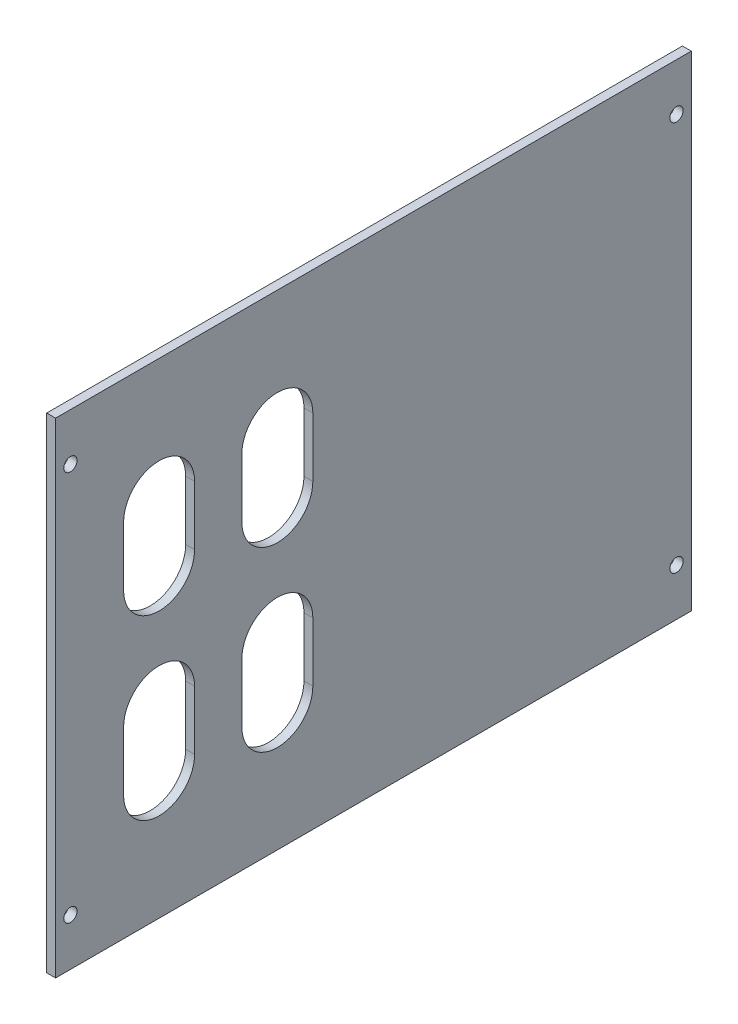
ISO-10303-21;
HEADER;
FILE_DESCRIPTION(('STEP AP214'),'2;1');
FILE_NAME('part.step','',(''),(''),'','','');
FILE_SCHEMA(('AUTOMOTIVE_DESIGN { 1 0 10303 214 1 1 1 1 }'));
ENDSEC;
DATA;
#1=APPLICATION_CONTEXT('core data for automotive mechanical design processes');
#2=APPLICATION_PROTOCOL_DEFINITION('international standard','automotive_design',2000,#1);
#3=PRODUCT_CONTEXT('',#1,'mechanical');
#4=PRODUCT('Part','Part','',(#3));
#5=PRODUCT_RELATED_PRODUCT_CATEGORY('part','',(#4));
#6=PRODUCT_DEFINITION_FORMATION('','',#4);
#7=PRODUCT_DEFINITION_CONTEXT('part definition',#1,'design');
#8=PRODUCT_DEFINITION('design','',#6,#7);
#9=PRODUCT_DEFINITION_SHAPE('','',#8);
#10=(LENGTH_UNIT() NAMED_UNIT(*) SI_UNIT(.MILLI.,.METRE.));
#11=(NAMED_UNIT(*) PLANE_ANGLE_UNIT() SI_UNIT($,.RADIAN.));
#12=(NAMED_UNIT(*) SI_UNIT($,.STERADIAN.) SOLID_ANGLE_UNIT());
#13=UNCERTAINTY_MEASURE_WITH_UNIT(LENGTH_MEASURE(1.E-05),#10,'distance_accuracy_value','');
#14=(GEOMETRIC_REPRESENTATION_CONTEXT(3) GLOBAL_UNCERTAINTY_ASSIGNED_CONTEXT((#13)) GLOBAL_UNIT_ASSIGNED_CONTEXT((#10,
#11,#12)) REPRESENTATION_CONTEXT('',''));
#15=CARTESIAN_POINT('',(0.,0.,0.));
#16=DIRECTION('',(0.,0.,1.));
#17=DIRECTION('',(1.,0.,0.));
#18=AXIS2_PLACEMENT_3D('',#15,#16,#17);
#19=CARTESIAN_POINT('',(-120.,0.,0.));
#20=DIRECTION('',(1.,0.,0.));
#21=DIRECTION('',(0.,-1.,0.));
#22=AXIS2_PLACEMENT_3D('',#19,#20,#21);
#23=PLANE('',#22);
#24=CARTESIAN_POINT('',(-120.,-66.,108.));
#25=DIRECTION('',(1.,0.,0.));
#26=DIRECTION('',(0.,1.,0.));
#27=AXIS2_PLACEMENT_3D('',#24,#25,#26);
#28=CIRCLE('',#27,2.25);
#29=CARTESIAN_POINT('',(-120.,-63.75,108.));
#30=VERTEX_POINT('',#29);
#31=EDGE_CURVE('E145',#30,#30,#28,.T.);
#32=ORIENTED_EDGE('',*,*,#31,.T.);
#33=EDGE_LOOP('',(#32));
#34=FACE_BOUND('',#33,.T.);
#35=CARTESIAN_POINT('',(-120.,66.,108.));
#36=DIRECTION('',(1.,0.,0.));
#37=DIRECTION('',(0.,1.,0.));
#38=AXIS2_PLACEMENT_3D('',#35,#36,#37);
#39=CIRCLE('',#38,2.25);
#40=CARTESIAN_POINT('',(-120.,68.25,108.));
#41=VERTEX_POINT('',#40);
#42=EDGE_CURVE('E227',#41,#41,#39,.T.);
#43=ORIENTED_EDGE('',*,*,#42,.T.);
#44=EDGE_LOOP('',(#43));
#45=FACE_BOUND('',#44,.T.);
#46=DIRECTION('',(0.,1.,0.));
#47=VECTOR('',#46,1.);
#48=CARTESIAN_POINT('',(-120.,40.,66.));
#49=LINE('',#48,#47);
#50=CARTESIAN_POINT('',(-120.,20.,66.));
#51=VERTEX_POINT('',#50);
#52=CARTESIAN_POINT('',(-120.,40.,66.));
#53=VERTEX_POINT('',#52);
#54=EDGE_CURVE('E264',#51,#53,#49,.T.);
#55=ORIENTED_EDGE('',*,*,#54,.T.);
#56=CARTESIAN_POINT('',(-120.,40.,78.));
#57=DIRECTION('',(1.,0.,0.));
#58=DIRECTION('',(0.,1.,0.));
#59=AXIS2_PLACEMENT_3D('',#56,#57,#58);
#60=CIRCLE('',#59,12.);
#61=CARTESIAN_POINT('',(-120.,40.,90.));
#62=VERTEX_POINT('',#61);
#63=EDGE_CURVE('E256',#53,#62,#60,.T.);
#64=ORIENTED_EDGE('',*,*,#63,.T.);
#65=DIRECTION('',(0.,-1.,0.));
#66=VECTOR('',#65,1.);
#67=CARTESIAN_POINT('',(-120.,40.,90.));
#68=LINE('',#67,#66);
#69=CARTESIAN_POINT('',(-120.,19.9999999999999,90.));
#70=VERTEX_POINT('',#69);
#71=EDGE_CURVE('E259',#62,#70,#68,.T.);
#72=ORIENTED_EDGE('',*,*,#71,.T.);
#73=CARTESIAN_POINT('',(-120.,20.,78.));
#74=DIRECTION('',(1.,0.,0.));
#75=DIRECTION('',(0.,1.,0.));
#76=AXIS2_PLACEMENT_3D('',#73,#74,#75);
#77=CIRCLE('',#76,12.);
#78=EDGE_CURVE('E39',#70,#51,#77,.T.);
#79=ORIENTED_EDGE('',*,*,#78,.T.);
#80=EDGE_LOOP('',(#55,#64,#72,#79));
#81=FACE_BOUND('',#80,.T.);
#82=DIRECTION('',(0.,-1.,0.));
#83=VECTOR('',#82,1.);
#84=CARTESIAN_POINT('',(-120.,-39.9999999999999,90.));
#85=LINE('',#84,#83);
#86=CARTESIAN_POINT('',(-120.,-19.9999999999999,90.));
#87=VERTEX_POINT('',#86);
#88=CARTESIAN_POINT('',(-120.,-39.9999999999999,90.));
#89=VERTEX_POINT('',#88);
#90=EDGE_CURVE('E278',#87,#89,#85,.T.);
#91=ORIENTED_EDGE('',*,*,#90,.T.);
#92=CARTESIAN_POINT('',(-120.,-39.9999999999999,78.));
#93=DIRECTION('',(1.,0.,0.));
#94=DIRECTION('',(0.,-1.,0.));
#95=AXIS2_PLACEMENT_3D('',#92,#93,#94);
#96=CIRCLE('',#95,12.);
#97=CARTESIAN_POINT('',(-120.,-39.9999999999999,66.));
#98=VERTEX_POINT('',#97);
#99=EDGE_CURVE('E260',#89,#98,#96,.T.);
#100=ORIENTED_EDGE('',*,*,#99,.T.);
#101=DIRECTION('',(0.,1.,0.));
#102=VECTOR('',#101,1.);
#103=CARTESIAN_POINT('',(-120.,-39.9999999999999,66.));
#104=LINE('',#103,#102);
#105=CARTESIAN_POINT('',(-120.,-19.9999999999999,66.));
#106=VERTEX_POINT('',#105);
#107=EDGE_CURVE('E292',#98,#106,#104,.T.);
#108=ORIENTED_EDGE('',*,*,#107,.T.);
#109=CARTESIAN_POINT('',(-120.,-19.9999999999999,78.));
#110=DIRECTION('',(1.,0.,0.));
#111=DIRECTION('',(0.,-1.,0.));
#112=AXIS2_PLACEMENT_3D('',#109,#110,#111);
#113=CIRCLE('',#112,12.);
#114=EDGE_CURVE('E289',#106,#87,#113,.T.);
#115=ORIENTED_EDGE('',*,*,#114,.T.);
#116=EDGE_LOOP('',(#91,#100,#108,#115));
#117=FACE_BOUND('',#116,.T.);
#118=DIRECTION('',(0.,-1.,0.));
#119=VECTOR('',#118,1.);
#120=CARTESIAN_POINT('',(-120.,-39.9999999999999,50.));
#121=LINE('',#120,#119);
#122=CARTESIAN_POINT('',(-120.,-19.9999999999999,50.));
#123=VERTEX_POINT('',#122);
#124=CARTESIAN_POINT('',(-120.,-39.9999999999999,50.));
#125=VERTEX_POINT('',#124);
#126=EDGE_CURVE('E113',#123,#125,#121,.T.);
#127=ORIENTED_EDGE('',*,*,#126,.T.);
#128=CARTESIAN_POINT('',(-120.,-39.9999999999999,38.));
#129=DIRECTION('',(1.,0.,0.));
#130=DIRECTION('',(0.,1.,0.));
#131=AXIS2_PLACEMENT_3D('',#128,#129,#130);
#132=CIRCLE('',#131,12.);
#133=CARTESIAN_POINT('',(-120.,-39.9999999999999,26.));
#134=VERTEX_POINT('',#133);
#135=EDGE_CURVE('E127',#125,#134,#132,.T.);
#136=ORIENTED_EDGE('',*,*,#135,.T.);
#137=DIRECTION('',(0.,1.,0.));
#138=VECTOR('',#137,1.);
#139=CARTESIAN_POINT('',(-120.,-39.9999999999999,26.));
#140=LINE('',#139,#138);
#141=CARTESIAN_POINT('',(-120.,-19.9999999999999,26.));
#142=VERTEX_POINT('',#141);
#143=EDGE_CURVE('E112',#134,#142,#140,.T.);
#144=ORIENTED_EDGE('',*,*,#143,.T.);
#145=CARTESIAN_POINT('',(-120.,-19.9999999999999,38.));
#146=DIRECTION('',(1.,0.,0.));
#147=DIRECTION('',(0.,1.,0.));
#148=AXIS2_PLACEMENT_3D('',#145,#146,#147);
#149=CIRCLE('',#148,12.);
#150=EDGE_CURVE('E98',#142,#123,#149,.T.);
#151=ORIENTED_EDGE('',*,*,#150,.T.);
#152=EDGE_LOOP('',(#127,#136,#144,#151));
#153=FACE_BOUND('',#152,.T.);
#154=DIRECTION('',(0.,1.,0.));
#155=VECTOR('',#154,1.);
#156=CARTESIAN_POINT('',(-120.,40.,26.));
#157=LINE('',#156,#155);
#158=CARTESIAN_POINT('',(-120.,20.0000000000001,26.));
#159=VERTEX_POINT('',#158);
#160=CARTESIAN_POINT('',(-120.,40.,26.));
#161=VERTEX_POINT('',#160);
#162=EDGE_CURVE('E135',#159,#161,#157,.T.);
#163=ORIENTED_EDGE('',*,*,#162,.T.);
#164=CARTESIAN_POINT('',(-120.,40.0000000000001,38.));
#165=DIRECTION('',(1.,0.,0.));
#166=DIRECTION('',(0.,-1.,0.));
#167=AXIS2_PLACEMENT_3D('',#164,#165,#166);
#168=CIRCLE('',#167,12.);
#169=CARTESIAN_POINT('',(-120.,40.,50.));
#170=VERTEX_POINT('',#169);
#171=EDGE_CURVE('E154',#161,#170,#168,.T.);
#172=ORIENTED_EDGE('',*,*,#171,.T.);
#173=DIRECTION('',(0.,-1.,0.));
#174=VECTOR('',#173,1.);
#175=CARTESIAN_POINT('',(-120.,40.,50.));
#176=LINE('',#175,#174);
#177=CARTESIAN_POINT('',(-120.,19.9999999999999,50.));
#178=VERTEX_POINT('',#177);
#179=EDGE_CURVE('E151',#170,#178,#176,.T.);
#180=ORIENTED_EDGE('',*,*,#179,.T.);
#181=CARTESIAN_POINT('',(-120.,20.0000000000001,38.));
#182=DIRECTION('',(1.,0.,0.));
#183=DIRECTION('',(0.,-1.,0.));
#184=AXIS2_PLACEMENT_3D('',#181,#182,#183);
#185=CIRCLE('',#184,12.);
#186=EDGE_CURVE('E148',#178,#159,#185,.T.);
#187=ORIENTED_EDGE('',*,*,#186,.T.);
#188=EDGE_LOOP('',(#163,#172,#180,#187));
#189=FACE_BOUND('',#188,.T.);
#190=DIRECTION('',(0.,-1.,0.));
#191=VECTOR('',#190,1.);
#192=CARTESIAN_POINT('',(-120.,-82.,113.));
#193=LINE('',#192,#191);
#194=CARTESIAN_POINT('',(-120.,82.,113.));
#195=VERTEX_POINT('',#194);
#196=CARTESIAN_POINT('',(-120.,-82.,113.));
#197=VERTEX_POINT('',#196);
#198=EDGE_CURVE('E158',#195,#197,#193,.T.);
#199=ORIENTED_EDGE('',*,*,#198,.F.);
#200=DIRECTION('',(0.,0.,1.));
#201=VECTOR('',#200,1.);
#202=CARTESIAN_POINT('',(-120.,82.,113.));
#203=LINE('',#202,#201);
#204=CARTESIAN_POINT('',(-120.,82.,-102.));
#205=VERTEX_POINT('',#204);
#206=EDGE_CURVE('E165',#205,#195,#203,.T.);
#207=ORIENTED_EDGE('',*,*,#206,.F.);
#208=DIRECTION('',(0.,1.,0.));
#209=VECTOR('',#208,1.);
#210=CARTESIAN_POINT('',(-120.,-82.,-102.));
#211=LINE('',#210,#209);
#212=CARTESIAN_POINT('',(-120.,-82.,-102.));
#213=VERTEX_POINT('',#212);
#214=EDGE_CURVE('E164',#213,#205,#211,.T.);
#215=ORIENTED_EDGE('',*,*,#214,.F.);
#216=DIRECTION('',(0.,0.,-1.));
#217=VECTOR('',#216,1.);
#218=CARTESIAN_POINT('',(-120.,-82.,113.));
#219=LINE('',#218,#217);
#220=EDGE_CURVE('E161',#197,#213,#219,.T.);
#221=ORIENTED_EDGE('',*,*,#220,.F.);
#222=EDGE_LOOP('',(#199,#207,#215,#221));
#223=FACE_BOUND('',#222,.T.);
#224=CARTESIAN_POINT('',(-120.,-66.0000000000006,-97.));
#225=DIRECTION('',(1.,0.,0.));
#226=DIRECTION('',(0.,1.,0.));
#227=AXIS2_PLACEMENT_3D('',#224,#225,#226);
#228=CIRCLE('',#227,2.25);
#229=CARTESIAN_POINT('',(-120.,-63.7500000000006,-97.));
#230=VERTEX_POINT('',#229);
#231=EDGE_CURVE('E173',#230,#230,#228,.T.);
#232=ORIENTED_EDGE('',*,*,#231,.T.);
#233=EDGE_LOOP('',(#232));
#234=FACE_BOUND('',#233,.T.);
#235=CARTESIAN_POINT('',(-120.,66.0000000000004,-97.));
#236=DIRECTION('',(1.,0.,0.));
#237=DIRECTION('',(0.,1.,0.));
#238=AXIS2_PLACEMENT_3D('',#235,#236,#237);
#239=CIRCLE('',#238,2.25);
#240=CARTESIAN_POINT('',(-120.,68.2500000000004,-97.));
#241=VERTEX_POINT('',#240);
#242=EDGE_CURVE('E236',#241,#241,#239,.T.);
#243=ORIENTED_EDGE('',*,*,#242,.T.);
#244=EDGE_LOOP('',(#243));
#245=FACE_BOUND('',#244,.T.);
#246=ADVANCED_FACE('F19',(#34,#45,#81,#117,#153,#189,#223,#234,#245),#23,.F.);
#247=CARTESIAN_POINT('',(-117.,0.,0.));
#248=DIRECTION('',(1.,0.,0.));
#249=DIRECTION('',(0.,-1.,0.));
#250=AXIS2_PLACEMENT_3D('',#247,#248,#249);
#251=PLANE('',#250);
#252=CARTESIAN_POINT('',(-117.,-66.,108.));
#253=DIRECTION('',(1.,0.,0.));
#254=DIRECTION('',(0.,1.,0.));
#255=AXIS2_PLACEMENT_3D('',#252,#253,#254);
#256=CIRCLE('',#255,2.25);
#257=CARTESIAN_POINT('',(-117.,-63.75,108.));
#258=VERTEX_POINT('',#257);
#259=EDGE_CURVE('E228',#258,#258,#256,.T.);
#260=ORIENTED_EDGE('',*,*,#259,.F.);
#261=EDGE_LOOP('',(#260));
#262=FACE_BOUND('',#261,.T.);
#263=CARTESIAN_POINT('',(-117.,66.,108.));
#264=DIRECTION('',(1.,0.,0.));
#265=DIRECTION('',(0.,1.,0.));
#266=AXIS2_PLACEMENT_3D('',#263,#264,#265);
#267=CIRCLE('',#266,2.25);
#268=CARTESIAN_POINT('',(-117.,68.25,108.));
#269=VERTEX_POINT('',#268);
#270=EDGE_CURVE('E223',#269,#269,#267,.T.);
#271=ORIENTED_EDGE('',*,*,#270,.F.);
#272=EDGE_LOOP('',(#271));
#273=FACE_BOUND('',#272,.T.);
#274=CARTESIAN_POINT('',(-117.,40.,78.));
#275=DIRECTION('',(1.,0.,0.));
#276=DIRECTION('',(0.,1.,0.));
#277=AXIS2_PLACEMENT_3D('',#274,#275,#276);
#278=CIRCLE('',#277,12.);
#279=CARTESIAN_POINT('',(-117.,40.,66.));
#280=VERTEX_POINT('',#279);
#281=CARTESIAN_POINT('',(-117.,40.,90.));
#282=VERTEX_POINT('',#281);
#283=EDGE_CURVE('E11',#280,#282,#278,.T.);
#284=ORIENTED_EDGE('',*,*,#283,.F.);
#285=DIRECTION('',(0.,1.,0.));
#286=VECTOR('',#285,1.);
#287=CARTESIAN_POINT('',(-117.,0.,66.));
#288=LINE('',#287,#286);
#289=CARTESIAN_POINT('',(-117.,20.,66.));
#290=VERTEX_POINT('',#289);
#291=EDGE_CURVE('E30',#290,#280,#288,.T.);
#292=ORIENTED_EDGE('',*,*,#291,.F.);
#293=CARTESIAN_POINT('',(-117.,20.,78.));
#294=DIRECTION('',(1.,0.,0.));
#295=DIRECTION('',(0.,1.,0.));
#296=AXIS2_PLACEMENT_3D('',#293,#294,#295);
#297=CIRCLE('',#296,12.);
#298=CARTESIAN_POINT('',(-117.,20.,90.));
#299=VERTEX_POINT('',#298);
#300=EDGE_CURVE('E218',#299,#290,#297,.T.);
#301=ORIENTED_EDGE('',*,*,#300,.F.);
#302=DIRECTION('',(0.,-1.,0.));
#303=VECTOR('',#302,1.);
#304=CARTESIAN_POINT('',(-117.,0.,90.));
#305=LINE('',#304,#303);
#306=EDGE_CURVE('E215',#282,#299,#305,.T.);
#307=ORIENTED_EDGE('',*,*,#306,.F.);
#308=EDGE_LOOP('',(#284,#292,#301,#307));
#309=FACE_BOUND('',#308,.T.);
#310=CARTESIAN_POINT('',(-117.,-39.9999999999999,78.));
#311=DIRECTION('',(1.,0.,0.));
#312=DIRECTION('',(0.,1.,0.));
#313=AXIS2_PLACEMENT_3D('',#310,#311,#312);
#314=CIRCLE('',#313,12.);
#315=CARTESIAN_POINT('',(-117.,-39.9999999999999,90.));
#316=VERTEX_POINT('',#315);
#317=CARTESIAN_POINT('',(-117.,-40.0000000000001,66.));
#318=VERTEX_POINT('',#317);
#319=EDGE_CURVE('E212',#316,#318,#314,.T.);
#320=ORIENTED_EDGE('',*,*,#319,.F.);
#321=DIRECTION('',(0.,-1.,0.));
#322=VECTOR('',#321,1.);
#323=CARTESIAN_POINT('',(-117.,-1.41654980428545E-13,90.));
#324=LINE('',#323,#322);
#325=CARTESIAN_POINT('',(-117.,-19.9999999999999,90.));
#326=VERTEX_POINT('',#325);
#327=EDGE_CURVE('E209',#326,#316,#324,.T.);
#328=ORIENTED_EDGE('',*,*,#327,.F.);
#329=CARTESIAN_POINT('',(-117.,-19.9999999999999,78.));
#330=DIRECTION('',(1.,0.,0.));
#331=DIRECTION('',(0.,1.,0.));
#332=AXIS2_PLACEMENT_3D('',#329,#330,#331);
#333=CIRCLE('',#332,12.);
#334=CARTESIAN_POINT('',(-117.,-19.9999999999999,66.));
#335=VERTEX_POINT('',#334);
#336=EDGE_CURVE('E206',#335,#326,#333,.T.);
#337=ORIENTED_EDGE('',*,*,#336,.F.);
#338=DIRECTION('',(0.,1.,0.));
#339=VECTOR('',#338,1.);
#340=CARTESIAN_POINT('',(-117.,0.,66.));
#341=LINE('',#340,#339);
#342=EDGE_CURVE('E203',#318,#335,#341,.T.);
#343=ORIENTED_EDGE('',*,*,#342,.F.);
#344=EDGE_LOOP('',(#320,#328,#337,#343));
#345=FACE_BOUND('',#344,.T.);
#346=CARTESIAN_POINT('',(-117.,-39.9999999999999,38.));
#347=DIRECTION('',(1.,0.,0.));
#348=DIRECTION('',(0.,1.,0.));
#349=AXIS2_PLACEMENT_3D('',#346,#347,#348);
#350=CIRCLE('',#349,12.);
#351=CARTESIAN_POINT('',(-117.,-39.9999999999999,50.));
#352=VERTEX_POINT('',#351);
#353=CARTESIAN_POINT('',(-117.,-40.0000000000001,26.));
#354=VERTEX_POINT('',#353);
#355=EDGE_CURVE('E200',#352,#354,#350,.T.);
#356=ORIENTED_EDGE('',*,*,#355,.F.);
#357=DIRECTION('',(0.,-1.,0.));
#358=VECTOR('',#357,1.);
#359=CARTESIAN_POINT('',(-117.,0.,50.));
#360=LINE('',#359,#358);
#361=CARTESIAN_POINT('',(-117.,-19.9999999999999,50.));
#362=VERTEX_POINT('',#361);
#363=EDGE_CURVE('E197',#362,#352,#360,.T.);
#364=ORIENTED_EDGE('',*,*,#363,.F.);
#365=CARTESIAN_POINT('',(-117.,-19.9999999999999,38.));
#366=DIRECTION('',(1.,0.,0.));
#367=DIRECTION('',(0.,1.,0.));
#368=AXIS2_PLACEMENT_3D('',#365,#366,#367);
#369=CIRCLE('',#368,12.);
#370=CARTESIAN_POINT('',(-117.,-19.9999999999999,26.));
#371=VERTEX_POINT('',#370);
#372=EDGE_CURVE('E195',#371,#362,#369,.T.);
#373=ORIENTED_EDGE('',*,*,#372,.F.);
#374=DIRECTION('',(0.,1.,0.));
#375=VECTOR('',#374,1.);
#376=CARTESIAN_POINT('',(-117.,0.,26.));
#377=LINE('',#376,#375);
#378=EDGE_CURVE('E122',#354,#371,#377,.T.);
#379=ORIENTED_EDGE('',*,*,#378,.F.);
#380=EDGE_LOOP('',(#356,#364,#373,#379));
#381=FACE_BOUND('',#380,.T.);
#382=CARTESIAN_POINT('',(-117.,40.0000000000001,38.));
#383=DIRECTION('',(1.,0.,0.));
#384=DIRECTION('',(0.,1.,0.));
#385=AXIS2_PLACEMENT_3D('',#382,#383,#384);
#386=CIRCLE('',#385,12.);
#387=CARTESIAN_POINT('',(-117.,40.,26.));
#388=VERTEX_POINT('',#387);
#389=CARTESIAN_POINT('',(-117.,40.,50.));
#390=VERTEX_POINT('',#389);
#391=EDGE_CURVE('E191',#388,#390,#386,.T.);
#392=ORIENTED_EDGE('',*,*,#391,.F.);
#393=DIRECTION('',(0.,1.,0.));
#394=VECTOR('',#393,1.);
#395=CARTESIAN_POINT('',(-117.,0.,26.));
#396=LINE('',#395,#394);
#397=CARTESIAN_POINT('',(-117.,20.,26.));
#398=VERTEX_POINT('',#397);
#399=EDGE_CURVE('E188',#398,#388,#396,.T.);
#400=ORIENTED_EDGE('',*,*,#399,.F.);
#401=CARTESIAN_POINT('',(-117.,20.0000000000001,38.));
#402=DIRECTION('',(1.,0.,0.));
#403=DIRECTION('',(0.,1.,0.));
#404=AXIS2_PLACEMENT_3D('',#401,#402,#403);
#405=CIRCLE('',#404,12.);
#406=CARTESIAN_POINT('',(-117.,20.,50.));
#407=VERTEX_POINT('',#406);
#408=EDGE_CURVE('E185',#407,#398,#405,.T.);
#409=ORIENTED_EDGE('',*,*,#408,.F.);
#410=DIRECTION('',(0.,-1.,0.));
#411=VECTOR('',#410,1.);
#412=CARTESIAN_POINT('',(-117.,0.,50.));
#413=LINE('',#412,#411);
#414=EDGE_CURVE('E182',#390,#407,#413,.T.);
#415=ORIENTED_EDGE('',*,*,#414,.F.);
#416=EDGE_LOOP('',(#392,#400,#409,#415));
#417=FACE_BOUND('',#416,.T.);
#418=CARTESIAN_POINT('',(-117.,-66.0000000000006,-97.));
#419=DIRECTION('',(1.,0.,0.));
#420=DIRECTION('',(0.,1.,0.));
#421=AXIS2_PLACEMENT_3D('',#418,#419,#420);
#422=CIRCLE('',#421,2.25);
#423=CARTESIAN_POINT('',(-117.,-63.7500000000006,-97.));
#424=VERTEX_POINT('',#423);
#425=EDGE_CURVE('E23',#424,#424,#422,.T.);
#426=ORIENTED_EDGE('',*,*,#425,.F.);
#427=EDGE_LOOP('',(#426));
#428=FACE_BOUND('',#427,.T.);
#429=DIRECTION('',(0.,-1.,0.));
#430=VECTOR('',#429,1.);
#431=CARTESIAN_POINT('',(-117.,-82.,113.));
#432=LINE('',#431,#430);
#433=CARTESIAN_POINT('',(-117.,82.,113.));
#434=VERTEX_POINT('',#433);
#435=CARTESIAN_POINT('',(-117.,-82.,113.));
#436=VERTEX_POINT('',#435);
#437=EDGE_CURVE('E169',#434,#436,#432,.T.);
#438=ORIENTED_EDGE('',*,*,#437,.T.);
#439=DIRECTION('',(0.,0.,-1.));
#440=VECTOR('',#439,1.);
#441=CARTESIAN_POINT('',(-117.,-82.,113.));
#442=LINE('',#441,#440);
#443=CARTESIAN_POINT('',(-117.,-82.,-102.));
#444=VERTEX_POINT('',#443);
#445=EDGE_CURVE('E172',#436,#444,#442,.T.);
#446=ORIENTED_EDGE('',*,*,#445,.T.);
#447=DIRECTION('',(0.,1.,0.));
#448=VECTOR('',#447,1.);
#449=CARTESIAN_POINT('',(-117.,-82.,-102.));
#450=LINE('',#449,#448);
#451=CARTESIAN_POINT('',(-117.,82.,-102.));
#452=VERTEX_POINT('',#451);
#453=EDGE_CURVE('E176',#444,#452,#450,.T.);
#454=ORIENTED_EDGE('',*,*,#453,.T.);
#455=DIRECTION('',(0.,0.,1.));
#456=VECTOR('',#455,1.);
#457=CARTESIAN_POINT('',(-117.,82.,113.));
#458=LINE('',#457,#456);
#459=EDGE_CURVE('E162',#452,#434,#458,.T.);
#460=ORIENTED_EDGE('',*,*,#459,.T.);
#461=EDGE_LOOP('',(#438,#446,#454,#460));
#462=FACE_BOUND('',#461,.T.);
#463=CARTESIAN_POINT('',(-117.,66.0000000000004,-97.));
#464=DIRECTION('',(1.,0.,0.));
#465=DIRECTION('',(0.,1.,0.));
#466=AXIS2_PLACEMENT_3D('',#463,#464,#465);
#467=CIRCLE('',#466,2.25);
#468=CARTESIAN_POINT('',(-117.,68.2500000000004,-97.));
#469=VERTEX_POINT('',#468);
#470=EDGE_CURVE('E240',#469,#469,#467,.T.);
#471=ORIENTED_EDGE('',*,*,#470,.F.);
#472=EDGE_LOOP('',(#471));
#473=FACE_BOUND('',#472,.T.);
#474=ADVANCED_FACE('F354',(#262,#273,#309,#345,#381,#417,#428,#462,#473),#251,.T.);
#475=CARTESIAN_POINT('',(-120.,-82.,113.));
#476=DIRECTION('',(0.,0.,-1.));
#477=DIRECTION('',(1.,0.,0.));
#478=AXIS2_PLACEMENT_3D('',#475,#476,#477);
#479=PLANE('',#478);
#480=ORIENTED_EDGE('',*,*,#437,.F.);
#481=DIRECTION('',(1.,0.,0.));
#482=VECTOR('',#481,1.);
#483=CARTESIAN_POINT('',(-120.,82.,113.));
#484=LINE('',#483,#482);
#485=EDGE_CURVE('E168',#195,#434,#484,.T.);
#486=ORIENTED_EDGE('',*,*,#485,.F.);
#487=ORIENTED_EDGE('',*,*,#198,.T.);
#488=DIRECTION('',(1.,0.,0.));
#489=VECTOR('',#488,1.);
#490=CARTESIAN_POINT('',(-120.,-82.,113.));
#491=LINE('',#490,#489);
#492=EDGE_CURVE('E67',#197,#436,#491,.T.);
#493=ORIENTED_EDGE('',*,*,#492,.T.);
#494=EDGE_LOOP('',(#480,#486,#487,#493));
#495=FACE_BOUND('',#494,.T.);
#496=ADVANCED_FACE('F378',(#495),#479,.F.);
#497=CARTESIAN_POINT('',(-120.,-82.,113.));
#498=DIRECTION('',(0.,1.,0.));
#499=DIRECTION('',(1.,0.,0.));
#500=AXIS2_PLACEMENT_3D('',#497,#498,#499);
#501=PLANE('',#500);
#502=ORIENTED_EDGE('',*,*,#445,.F.);
#503=ORIENTED_EDGE('',*,*,#492,.F.);
#504=ORIENTED_EDGE('',*,*,#220,.T.);
#505=DIRECTION('',(1.,0.,0.));
#506=VECTOR('',#505,1.);
#507=CARTESIAN_POINT('',(-120.,-82.,-102.));
#508=LINE('',#507,#506);
#509=EDGE_CURVE('E60',#213,#444,#508,.T.);
#510=ORIENTED_EDGE('',*,*,#509,.T.);
#511=EDGE_LOOP('',(#502,#503,#504,#510));
#512=FACE_BOUND('',#511,.T.);
#513=ADVANCED_FACE('F392',(#512),#501,.F.);
#514=CARTESIAN_POINT('',(-120.,-82.,-102.));
#515=DIRECTION('',(0.,0.,1.));
#516=DIRECTION('',(0.,-1.,0.));
#517=AXIS2_PLACEMENT_3D('',#514,#515,#516);
#518=PLANE('',#517);
#519=ORIENTED_EDGE('',*,*,#453,.F.);
#520=ORIENTED_EDGE('',*,*,#509,.F.);
#521=ORIENTED_EDGE('',*,*,#214,.T.);
#522=DIRECTION('',(1.,0.,0.));
#523=VECTOR('',#522,1.);
#524=CARTESIAN_POINT('',(-120.,82.,-102.));
#525=LINE('',#524,#523);
#526=EDGE_CURVE('E180',#205,#452,#525,.T.);
#527=ORIENTED_EDGE('',*,*,#526,.T.);
#528=EDGE_LOOP('',(#519,#520,#521,#527));
#529=FACE_BOUND('',#528,.T.);
#530=ADVANCED_FACE('F390',(#529),#518,.F.);
#531=CARTESIAN_POINT('',(-120.,82.,113.));
#532=DIRECTION('',(0.,-1.,0.));
#533=DIRECTION('',(-1.,0.,0.));
#534=AXIS2_PLACEMENT_3D('',#531,#532,#533);
#535=PLANE('',#534);
#536=ORIENTED_EDGE('',*,*,#459,.F.);
#537=ORIENTED_EDGE('',*,*,#526,.F.);
#538=ORIENTED_EDGE('',*,*,#206,.T.);
#539=ORIENTED_EDGE('',*,*,#485,.T.);
#540=EDGE_LOOP('',(#536,#537,#538,#539));
#541=FACE_BOUND('',#540,.T.);
#542=ADVANCED_FACE('F386',(#541),#535,.F.);
#543=CARTESIAN_POINT('',(-120.,-66.0000000000006,-97.));
#544=DIRECTION('',(1.,0.,0.));
#545=DIRECTION('',(0.,-1.,0.));
#546=AXIS2_PLACEMENT_3D('',#543,#544,#545);
#547=CYLINDRICAL_SURFACE('',#546,2.25);
#548=ORIENTED_EDGE('',*,*,#231,.F.);
#549=EDGE_LOOP('',(#548));
#550=FACE_BOUND('',#549,.T.);
#551=ORIENTED_EDGE('',*,*,#425,.T.);
#552=EDGE_LOOP('',(#551));
#553=FACE_BOUND('',#552,.T.);
#554=ADVANCED_FACE('F389',(#550,#553),#547,.F.);
#555=CARTESIAN_POINT('',(-120.,66.0000000000004,-97.));
#556=DIRECTION('',(1.,0.,0.));
#557=DIRECTION('',(0.,-1.,0.));
#558=AXIS2_PLACEMENT_3D('',#555,#556,#557);
#559=CYLINDRICAL_SURFACE('',#558,2.25);
#560=ORIENTED_EDGE('',*,*,#242,.F.);
#561=EDGE_LOOP('',(#560));
#562=FACE_BOUND('',#561,.T.);
#563=ORIENTED_EDGE('',*,*,#470,.T.);
#564=EDGE_LOOP('',(#563));
#565=FACE_BOUND('',#564,.T.);
#566=ADVANCED_FACE('F21',(#562,#565),#559,.F.);
#567=CARTESIAN_POINT('',(-120.,40.0000000000001,38.));
#568=DIRECTION('',(1.,0.,0.));
#569=DIRECTION('',(0.,1.,0.));
#570=AXIS2_PLACEMENT_3D('',#567,#568,#569);
#571=CYLINDRICAL_SURFACE('',#570,12.);
#572=ORIENTED_EDGE('',*,*,#391,.T.);
#573=DIRECTION('',(1.,0.,0.));
#574=VECTOR('',#573,1.);
#575=CARTESIAN_POINT('',(-120.,40.,50.));
#576=LINE('',#575,#574);
#577=EDGE_CURVE('E133',#170,#390,#576,.T.);
#578=ORIENTED_EDGE('',*,*,#577,.F.);
#579=ORIENTED_EDGE('',*,*,#171,.F.);
#580=DIRECTION('',(1.,0.,0.));
#581=VECTOR('',#580,1.);
#582=CARTESIAN_POINT('',(-120.,40.,26.));
#583=LINE('',#582,#581);
#584=EDGE_CURVE('E142',#161,#388,#583,.T.);
#585=ORIENTED_EDGE('',*,*,#584,.T.);
#586=EDGE_LOOP('',(#572,#578,#579,#585));
#587=FACE_BOUND('',#586,.T.);
#588=ADVANCED_FACE('F405',(#587),#571,.F.);
#589=CARTESIAN_POINT('',(-120.,40.,26.));
#590=DIRECTION('',(0.,0.,-1.));
#591=DIRECTION('',(0.,1.,0.));
#592=AXIS2_PLACEMENT_3D('',#589,#590,#591);
#593=PLANE('',#592);
#594=ORIENTED_EDGE('',*,*,#399,.T.);
#595=ORIENTED_EDGE('',*,*,#584,.F.);
#596=ORIENTED_EDGE('',*,*,#162,.F.);
#597=DIRECTION('',(1.,0.,0.));
#598=VECTOR('',#597,1.);
#599=CARTESIAN_POINT('',(-120.,20.0000000000001,26.));
#600=LINE('',#599,#598);
#601=EDGE_CURVE('E139',#159,#398,#600,.T.);
#602=ORIENTED_EDGE('',*,*,#601,.T.);
#603=EDGE_LOOP('',(#594,#595,#596,#602));
#604=FACE_BOUND('',#603,.T.);
#605=ADVANCED_FACE('F383',(#604),#593,.F.);
#606=CARTESIAN_POINT('',(-120.,20.0000000000001,38.));
#607=DIRECTION('',(1.,0.,0.));
#608=DIRECTION('',(0.,1.,0.));
#609=AXIS2_PLACEMENT_3D('',#606,#607,#608);
#610=CYLINDRICAL_SURFACE('',#609,12.);
#611=ORIENTED_EDGE('',*,*,#408,.T.);
#612=ORIENTED_EDGE('',*,*,#601,.F.);
#613=ORIENTED_EDGE('',*,*,#186,.F.);
#614=DIRECTION('',(1.,0.,0.));
#615=VECTOR('',#614,1.);
#616=CARTESIAN_POINT('',(-120.,20.,50.));
#617=LINE('',#616,#615);
#618=EDGE_CURVE('E136',#178,#407,#617,.T.);
#619=ORIENTED_EDGE('',*,*,#618,.T.);
#620=EDGE_LOOP('',(#611,#612,#613,#619));
#621=FACE_BOUND('',#620,.T.);
#622=ADVANCED_FACE('F437',(#621),#610,.F.);
#623=CARTESIAN_POINT('',(-120.,40.,50.));
#624=DIRECTION('',(0.,0.,1.));
#625=DIRECTION('',(1.,0.,0.));
#626=AXIS2_PLACEMENT_3D('',#623,#624,#625);
#627=PLANE('',#626);
#628=ORIENTED_EDGE('',*,*,#414,.T.);
#629=ORIENTED_EDGE('',*,*,#618,.F.);
#630=ORIENTED_EDGE('',*,*,#179,.F.);
#631=ORIENTED_EDGE('',*,*,#577,.T.);
#632=EDGE_LOOP('',(#628,#629,#630,#631));
#633=FACE_BOUND('',#632,.T.);
#634=ADVANCED_FACE('F442',(#633),#627,.F.);
#635=CARTESIAN_POINT('',(-120.,-39.9999999999999,38.));
#636=DIRECTION('',(1.,0.,0.));
#637=DIRECTION('',(0.,1.,0.));
#638=AXIS2_PLACEMENT_3D('',#635,#636,#637);
#639=CYLINDRICAL_SURFACE('',#638,12.);
#640=ORIENTED_EDGE('',*,*,#355,.T.);
#641=DIRECTION('',(1.,0.,0.));
#642=VECTOR('',#641,1.);
#643=CARTESIAN_POINT('',(-120.,-39.9999999999999,26.));
#644=LINE('',#643,#642);
#645=EDGE_CURVE('E123',#134,#354,#644,.T.);
#646=ORIENTED_EDGE('',*,*,#645,.F.);
#647=ORIENTED_EDGE('',*,*,#135,.F.);
#648=DIRECTION('',(1.,0.,0.));
#649=VECTOR('',#648,1.);
#650=CARTESIAN_POINT('',(-120.,-39.9999999999999,50.));
#651=LINE('',#650,#649);
#652=EDGE_CURVE('E157',#125,#352,#651,.T.);
#653=ORIENTED_EDGE('',*,*,#652,.T.);
#654=EDGE_LOOP('',(#640,#646,#647,#653));
#655=FACE_BOUND('',#654,.T.);
#656=ADVANCED_FACE('F444',(#655),#639,.F.);
#657=CARTESIAN_POINT('',(-120.,-39.9999999999999,50.));
#658=DIRECTION('',(0.,0.,1.));
#659=DIRECTION('',(1.,0.,0.));
#660=AXIS2_PLACEMENT_3D('',#657,#658,#659);
#661=PLANE('',#660);
#662=ORIENTED_EDGE('',*,*,#363,.T.);
#663=ORIENTED_EDGE('',*,*,#652,.F.);
#664=ORIENTED_EDGE('',*,*,#126,.F.);
#665=DIRECTION('',(1.,0.,0.));
#666=VECTOR('',#665,1.);
#667=CARTESIAN_POINT('',(-120.,-19.9999999999999,50.));
#668=LINE('',#667,#666);
#669=EDGE_CURVE('E107',#123,#362,#668,.T.);
#670=ORIENTED_EDGE('',*,*,#669,.T.);
#671=EDGE_LOOP('',(#662,#663,#664,#670));
#672=FACE_BOUND('',#671,.T.);
#673=ADVANCED_FACE('F305',(#672),#661,.F.);
#674=CARTESIAN_POINT('',(-120.,-19.9999999999999,38.));
#675=DIRECTION('',(1.,0.,0.));
#676=DIRECTION('',(0.,1.,0.));
#677=AXIS2_PLACEMENT_3D('',#674,#675,#676);
#678=CYLINDRICAL_SURFACE('',#677,12.);
#679=ORIENTED_EDGE('',*,*,#372,.T.);
#680=ORIENTED_EDGE('',*,*,#669,.F.);
#681=ORIENTED_EDGE('',*,*,#150,.F.);
#682=DIRECTION('',(1.,0.,0.));
#683=VECTOR('',#682,1.);
#684=CARTESIAN_POINT('',(-120.,-19.9999999999999,26.));
#685=LINE('',#684,#683);
#686=EDGE_CURVE('E103',#142,#371,#685,.T.);
#687=ORIENTED_EDGE('',*,*,#686,.T.);
#688=EDGE_LOOP('',(#679,#680,#681,#687));
#689=FACE_BOUND('',#688,.T.);
#690=ADVANCED_FACE('F101',(#689),#678,.F.);
#691=CARTESIAN_POINT('',(-120.,-39.9999999999999,26.));
#692=DIRECTION('',(0.,0.,-1.));
#693=DIRECTION('',(0.,1.,0.));
#694=AXIS2_PLACEMENT_3D('',#691,#692,#693);
#695=PLANE('',#694);
#696=ORIENTED_EDGE('',*,*,#378,.T.);
#697=ORIENTED_EDGE('',*,*,#686,.F.);
#698=ORIENTED_EDGE('',*,*,#143,.F.);
#699=ORIENTED_EDGE('',*,*,#645,.T.);
#700=EDGE_LOOP('',(#696,#697,#698,#699));
#701=FACE_BOUND('',#700,.T.);
#702=ADVANCED_FACE('F118',(#701),#695,.F.);
#703=CARTESIAN_POINT('',(-120.,-39.9999999999999,78.));
#704=DIRECTION('',(1.,0.,0.));
#705=DIRECTION('',(0.,1.,0.));
#706=AXIS2_PLACEMENT_3D('',#703,#704,#705);
#707=CYLINDRICAL_SURFACE('',#706,12.);
#708=ORIENTED_EDGE('',*,*,#319,.T.);
#709=DIRECTION('',(1.,0.,0.));
#710=VECTOR('',#709,1.);
#711=CARTESIAN_POINT('',(-120.,-39.9999999999999,66.));
#712=LINE('',#711,#710);
#713=EDGE_CURVE('E276',#98,#318,#712,.T.);
#714=ORIENTED_EDGE('',*,*,#713,.F.);
#715=ORIENTED_EDGE('',*,*,#99,.F.);
#716=DIRECTION('',(1.,0.,0.));
#717=VECTOR('',#716,1.);
#718=CARTESIAN_POINT('',(-120.,-39.9999999999999,90.));
#719=LINE('',#718,#717);
#720=EDGE_CURVE('E129',#89,#316,#719,.T.);
#721=ORIENTED_EDGE('',*,*,#720,.T.);
#722=EDGE_LOOP('',(#708,#714,#715,#721));
#723=FACE_BOUND('',#722,.T.);
#724=ADVANCED_FACE('F498',(#723),#707,.F.);
#725=CARTESIAN_POINT('',(-120.,-39.9999999999999,90.));
#726=DIRECTION('',(0.,0.,1.));
#727=DIRECTION('',(0.,-1.,0.));
#728=AXIS2_PLACEMENT_3D('',#725,#726,#727);
#729=PLANE('',#728);
#730=ORIENTED_EDGE('',*,*,#327,.T.);
#731=ORIENTED_EDGE('',*,*,#720,.F.);
#732=ORIENTED_EDGE('',*,*,#90,.F.);
#733=DIRECTION('',(1.,0.,0.));
#734=VECTOR('',#733,1.);
#735=CARTESIAN_POINT('',(-120.,-19.9999999999999,90.));
#736=LINE('',#735,#734);
#737=EDGE_CURVE('E282',#87,#326,#736,.T.);
#738=ORIENTED_EDGE('',*,*,#737,.T.);
#739=EDGE_LOOP('',(#730,#731,#732,#738));
#740=FACE_BOUND('',#739,.T.);
#741=ADVANCED_FACE('F506',(#740),#729,.F.);
#742=CARTESIAN_POINT('',(-120.,-19.9999999999999,78.));
#743=DIRECTION('',(1.,0.,0.));
#744=DIRECTION('',(0.,1.,0.));
#745=AXIS2_PLACEMENT_3D('',#742,#743,#744);
#746=CYLINDRICAL_SURFACE('',#745,12.);
#747=ORIENTED_EDGE('',*,*,#336,.T.);
#748=ORIENTED_EDGE('',*,*,#737,.F.);
#749=ORIENTED_EDGE('',*,*,#114,.F.);
#750=DIRECTION('',(1.,0.,0.));
#751=VECTOR('',#750,1.);
#752=CARTESIAN_POINT('',(-120.,-19.9999999999999,66.));
#753=LINE('',#752,#751);
#754=EDGE_CURVE('E279',#106,#335,#753,.T.);
#755=ORIENTED_EDGE('',*,*,#754,.T.);
#756=EDGE_LOOP('',(#747,#748,#749,#755));
#757=FACE_BOUND('',#756,.T.);
#758=ADVANCED_FACE('F515',(#757),#746,.F.);
#759=CARTESIAN_POINT('',(-120.,-39.9999999999999,66.));
#760=DIRECTION('',(0.,0.,-1.));
#761=DIRECTION('',(-1.,0.,0.));
#762=AXIS2_PLACEMENT_3D('',#759,#760,#761);
#763=PLANE('',#762);
#764=ORIENTED_EDGE('',*,*,#342,.T.);
#765=ORIENTED_EDGE('',*,*,#754,.F.);
#766=ORIENTED_EDGE('',*,*,#107,.F.);
#767=ORIENTED_EDGE('',*,*,#713,.T.);
#768=EDGE_LOOP('',(#764,#765,#766,#767));
#769=FACE_BOUND('',#768,.T.);
#770=ADVANCED_FACE('F524',(#769),#763,.F.);
#771=CARTESIAN_POINT('',(-120.,40.,78.));
#772=DIRECTION('',(1.,0.,0.));
#773=DIRECTION('',(0.,1.,0.));
#774=AXIS2_PLACEMENT_3D('',#771,#772,#773);
#775=CYLINDRICAL_SURFACE('',#774,12.);
#776=ORIENTED_EDGE('',*,*,#283,.T.);
#777=DIRECTION('',(1.,0.,0.));
#778=VECTOR('',#777,1.);
#779=CARTESIAN_POINT('',(-120.,40.,90.));
#780=LINE('',#779,#778);
#781=EDGE_CURVE('E267',#62,#282,#780,.T.);
#782=ORIENTED_EDGE('',*,*,#781,.F.);
#783=ORIENTED_EDGE('',*,*,#63,.F.);
#784=DIRECTION('',(1.,0.,0.));
#785=VECTOR('',#784,1.);
#786=CARTESIAN_POINT('',(-120.,40.,66.));
#787=LINE('',#786,#785);
#788=EDGE_CURVE('E244',#53,#280,#787,.T.);
#789=ORIENTED_EDGE('',*,*,#788,.T.);
#790=EDGE_LOOP('',(#776,#782,#783,#789));
#791=FACE_BOUND('',#790,.T.);
#792=ADVANCED_FACE('F351',(#791),#775,.F.);
#793=CARTESIAN_POINT('',(-120.,40.,66.));
#794=DIRECTION('',(0.,0.,-1.));
#795=DIRECTION('',(-1.,0.,0.));
#796=AXIS2_PLACEMENT_3D('',#793,#794,#795);
#797=PLANE('',#796);
#798=ORIENTED_EDGE('',*,*,#291,.T.);
#799=ORIENTED_EDGE('',*,*,#788,.F.);
#800=ORIENTED_EDGE('',*,*,#54,.F.);
#801=DIRECTION('',(1.,0.,0.));
#802=VECTOR('',#801,1.);
#803=CARTESIAN_POINT('',(-120.,20.,66.));
#804=LINE('',#803,#802);
#805=EDGE_CURVE('E270',#51,#290,#804,.T.);
#806=ORIENTED_EDGE('',*,*,#805,.T.);
#807=EDGE_LOOP('',(#798,#799,#800,#806));
#808=FACE_BOUND('',#807,.T.);
#809=ADVANCED_FACE('F345',(#808),#797,.F.);
#810=CARTESIAN_POINT('',(-120.,20.,78.));
#811=DIRECTION('',(1.,0.,0.));
#812=DIRECTION('',(0.,1.,0.));
#813=AXIS2_PLACEMENT_3D('',#810,#811,#812);
#814=CYLINDRICAL_SURFACE('',#813,12.);
#815=ORIENTED_EDGE('',*,*,#300,.T.);
#816=ORIENTED_EDGE('',*,*,#805,.F.);
#817=ORIENTED_EDGE('',*,*,#78,.F.);
#818=DIRECTION('',(1.,0.,0.));
#819=VECTOR('',#818,1.);
#820=CARTESIAN_POINT('',(-120.,20.0000000000001,90.));
#821=LINE('',#820,#819);
#822=EDGE_CURVE('E273',#70,#299,#821,.T.);
#823=ORIENTED_EDGE('',*,*,#822,.T.);
#824=EDGE_LOOP('',(#815,#816,#817,#823));
#825=FACE_BOUND('',#824,.T.);
#826=ADVANCED_FACE('F359',(#825),#814,.F.);
#827=CARTESIAN_POINT('',(-120.,40.,90.));
#828=DIRECTION('',(0.,0.,1.));
#829=DIRECTION('',(0.,-1.,0.));
#830=AXIS2_PLACEMENT_3D('',#827,#828,#829);
#831=PLANE('',#830);
#832=ORIENTED_EDGE('',*,*,#306,.T.);
#833=ORIENTED_EDGE('',*,*,#822,.F.);
#834=ORIENTED_EDGE('',*,*,#71,.F.);
#835=ORIENTED_EDGE('',*,*,#781,.T.);
#836=EDGE_LOOP('',(#832,#833,#834,#835));
#837=FACE_BOUND('',#836,.T.);
#838=ADVANCED_FACE('F357',(#837),#831,.F.);
#839=CARTESIAN_POINT('',(-120.01,66.,108.));
#840=DIRECTION('',(1.,0.,0.));
#841=DIRECTION('',(0.,0.,-1.));
#842=AXIS2_PLACEMENT_3D('',#839,#840,#841);
#843=CYLINDRICAL_SURFACE('',#842,2.25);
#844=ORIENTED_EDGE('',*,*,#270,.T.);
#845=EDGE_LOOP('',(#844));
#846=FACE_BOUND('',#845,.T.);
#847=ORIENTED_EDGE('',*,*,#42,.F.);
#848=EDGE_LOOP('',(#847));
#849=FACE_BOUND('',#848,.T.);
#850=ADVANCED_FACE('F368',(#846,#849),#843,.F.);
#851=CARTESIAN_POINT('',(-120.01,-66.,108.));
#852=DIRECTION('',(1.,0.,0.));
#853=DIRECTION('',(0.,0.,-1.));
#854=AXIS2_PLACEMENT_3D('',#851,#852,#853);
#855=CYLINDRICAL_SURFACE('',#854,2.25);
#856=ORIENTED_EDGE('',*,*,#259,.T.);
#857=EDGE_LOOP('',(#856));
#858=FACE_BOUND('',#857,.T.);
#859=ORIENTED_EDGE('',*,*,#31,.F.);
#860=EDGE_LOOP('',(#859));
#861=FACE_BOUND('',#860,.T.);
#862=ADVANCED_FACE('F618',(#858,#861),#855,.F.);
#863=CLOSED_SHELL('',(#246,#474,#496,#513,#530,#542,#554,#566,#588,#605,#622,#634,#656,#673,
#690,#702,#724,#741,#758,#770,#792,#809,#826,#838,#850,#862));
#864=MANIFOLD_SOLID_BREP('B1',#863);
#865=ADVANCED_BREP_SHAPE_REPRESENTATION('',(#18,#864),#14);
#866=SHAPE_DEFINITION_REPRESENTATION(#9,#865);
ENDSEC;
END-ISO-10303-21;
